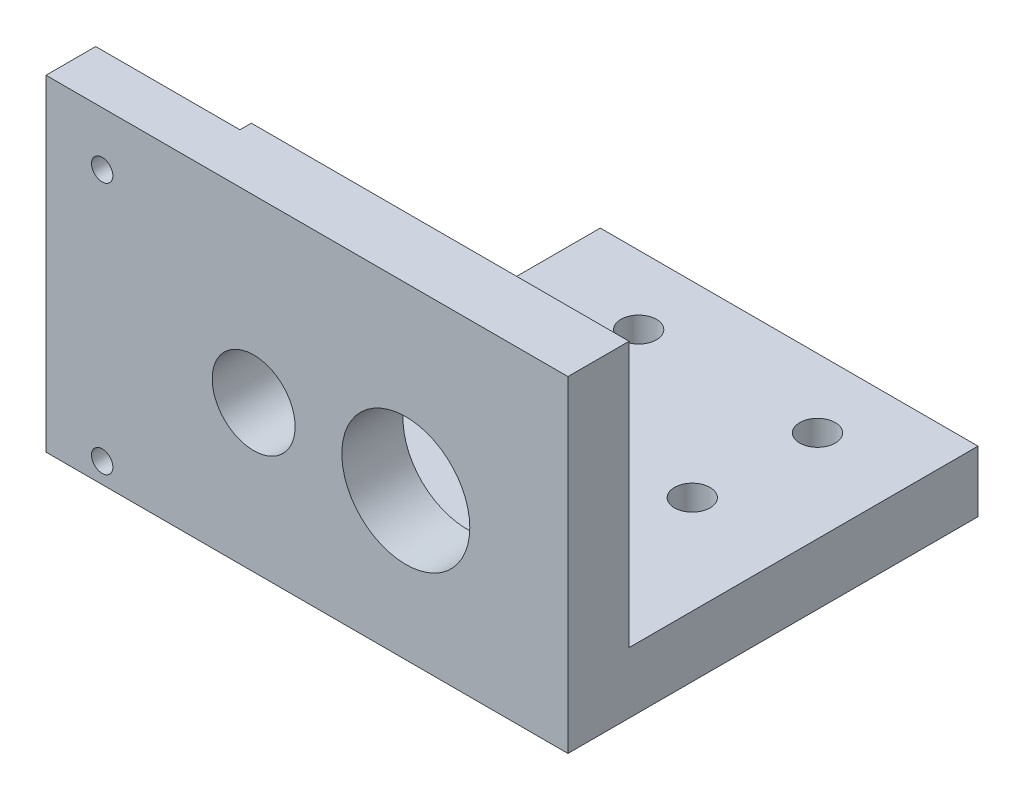
ISO-10303-21;
HEADER;
FILE_DESCRIPTION(('STEP AP214'),'2;1');
FILE_NAME('part.step','',(''),(''),'','','');
FILE_SCHEMA(('AUTOMOTIVE_DESIGN { 1 0 10303 214 1 1 1 1 }'));
ENDSEC;
DATA;
#1=APPLICATION_CONTEXT('core data for automotive mechanical design processes');
#2=APPLICATION_PROTOCOL_DEFINITION('international standard','automotive_design',2000,#1);
#3=PRODUCT_CONTEXT('',#1,'mechanical');
#4=PRODUCT('Part','Part','',(#3));
#5=PRODUCT_RELATED_PRODUCT_CATEGORY('part','',(#4));
#6=PRODUCT_DEFINITION_FORMATION('','',#4);
#7=PRODUCT_DEFINITION_CONTEXT('part definition',#1,'design');
#8=PRODUCT_DEFINITION('design','',#6,#7);
#9=PRODUCT_DEFINITION_SHAPE('','',#8);
#10=(LENGTH_UNIT() NAMED_UNIT(*) SI_UNIT(.MILLI.,.METRE.));
#11=(NAMED_UNIT(*) PLANE_ANGLE_UNIT() SI_UNIT($,.RADIAN.));
#12=(NAMED_UNIT(*) SI_UNIT($,.STERADIAN.) SOLID_ANGLE_UNIT());
#13=UNCERTAINTY_MEASURE_WITH_UNIT(LENGTH_MEASURE(1.E-05),#10,'distance_accuracy_value','');
#14=(GEOMETRIC_REPRESENTATION_CONTEXT(3) GLOBAL_UNCERTAINTY_ASSIGNED_CONTEXT((#13)) GLOBAL_UNIT_ASSIGNED_CONTEXT((#10,
#11,#12)) REPRESENTATION_CONTEXT('',''));
#15=CARTESIAN_POINT('',(0.,0.,0.));
#16=DIRECTION('',(0.,0.,1.));
#17=DIRECTION('',(1.,0.,0.));
#18=AXIS2_PLACEMENT_3D('',#15,#16,#17);
#19=CARTESIAN_POINT('',(-36.7,0.,4.3));
#20=DIRECTION('',(0.,0.,1.));
#21=DIRECTION('',(1.,0.,0.));
#22=AXIS2_PLACEMENT_3D('',#19,#20,#21);
#23=PLANE('',#22);
#24=CARTESIAN_POINT('',(-32.75,-11.2489652654603,4.3));
#25=DIRECTION('',(0.,0.,1.));
#26=DIRECTION('',(1.,0.,0.));
#27=AXIS2_PLACEMENT_3D('',#24,#25,#26);
#28=CIRCLE('',#27,0.749999999999999);
#29=CARTESIAN_POINT('',(-32.,-11.2489652654603,4.3));
#30=VERTEX_POINT('',#29);
#31=EDGE_CURVE('E180',#30,#30,#28,.T.);
#32=ORIENTED_EDGE('',*,*,#31,.F.);
#33=EDGE_LOOP('',(#32));
#34=FACE_BOUND('',#33,.T.);
#35=CARTESIAN_POINT('',(-32.75,-28.9989652654603,4.3));
#36=DIRECTION('',(0.,0.,1.));
#37=DIRECTION('',(1.,0.,0.));
#38=AXIS2_PLACEMENT_3D('',#35,#36,#37);
#39=CIRCLE('',#38,0.749999999999999);
#40=CARTESIAN_POINT('',(-32.,-28.9989652654603,4.3));
#41=VERTEX_POINT('',#40);
#42=EDGE_CURVE('E200',#41,#41,#39,.T.);
#43=ORIENTED_EDGE('',*,*,#42,.F.);
#44=EDGE_LOOP('',(#43));
#45=FACE_BOUND('',#44,.T.);
#46=CARTESIAN_POINT('',(-22.1,-20.1189652654603,4.3));
#47=DIRECTION('',(0.,0.,1.));
#48=DIRECTION('',(1.,0.,0.));
#49=AXIS2_PLACEMENT_3D('',#46,#47,#48);
#50=CIRCLE('',#49,2.915);
#51=CARTESIAN_POINT('',(-19.185,-20.1189652654603,4.3));
#52=VERTEX_POINT('',#51);
#53=EDGE_CURVE('E213',#52,#52,#50,.T.);
#54=ORIENTED_EDGE('',*,*,#53,.F.);
#55=EDGE_LOOP('',(#54));
#56=FACE_BOUND('',#55,.T.);
#57=CARTESIAN_POINT('',(-11.4,-20.1189652654603,4.3));
#58=DIRECTION('',(0.,0.,1.));
#59=DIRECTION('',(1.,0.,0.));
#60=AXIS2_PLACEMENT_3D('',#57,#58,#59);
#61=CIRCLE('',#60,4.5);
#62=CARTESIAN_POINT('',(-6.9,-20.1189652654603,4.3));
#63=VERTEX_POINT('',#62);
#64=EDGE_CURVE('E221',#63,#63,#61,.T.);
#65=ORIENTED_EDGE('',*,*,#64,.F.);
#66=EDGE_LOOP('',(#65));
#67=FACE_BOUND('',#66,.T.);
#68=DIRECTION('',(0.,1.,0.));
#69=VECTOR('',#68,1.);
#70=CARTESIAN_POINT('',(0.,0.,4.3));
#71=LINE('',#70,#69);
#72=CARTESIAN_POINT('',(0.,-7.47548067906314,4.3));
#73=VERTEX_POINT('',#72);
#74=CARTESIAN_POINT('',(0.,-30.4289652654603,4.3));
#75=VERTEX_POINT('',#74);
#76=EDGE_CURVE('E124',#73,#75,#71,.F.);
#77=ORIENTED_EDGE('',*,*,#76,.F.);
#78=DIRECTION('',(1.,0.,0.));
#79=VECTOR('',#78,1.);
#80=CARTESIAN_POINT('',(-36.7,-7.47548067906314,4.3));
#81=LINE('',#80,#79);
#82=CARTESIAN_POINT('',(-36.7,-7.47548067906314,4.3));
#83=VERTEX_POINT('',#82);
#84=EDGE_CURVE('E112',#83,#73,#81,.T.);
#85=ORIENTED_EDGE('',*,*,#84,.F.);
#86=DIRECTION('',(0.,1.,0.));
#87=VECTOR('',#86,1.);
#88=CARTESIAN_POINT('',(-36.7,0.,4.3));
#89=LINE('',#88,#87);
#90=CARTESIAN_POINT('',(-36.7,-30.4289652654603,4.3));
#91=VERTEX_POINT('',#90);
#92=EDGE_CURVE('E122',#83,#91,#89,.F.);
#93=ORIENTED_EDGE('',*,*,#92,.T.);
#94=DIRECTION('',(1.,0.,0.));
#95=VECTOR('',#94,1.);
#96=CARTESIAN_POINT('',(-36.7,-30.4289652654603,4.3));
#97=LINE('',#96,#95);
#98=EDGE_CURVE('E160',#91,#75,#97,.T.);
#99=ORIENTED_EDGE('',*,*,#98,.T.);
#100=EDGE_LOOP('',(#77,#85,#93,#99));
#101=FACE_BOUND('',#100,.T.);
#102=ADVANCED_FACE('F45',(#34,#45,#56,#67,#101),#23,.T.);
#103=CARTESIAN_POINT('',(-36.7,0.,0.));
#104=DIRECTION('',(0.,0.,1.));
#105=DIRECTION('',(1.,0.,0.));
#106=AXIS2_PLACEMENT_3D('',#103,#104,#105);
#107=PLANE('',#106);
#108=CARTESIAN_POINT('',(-11.4,-20.1189652654603,0.));
#109=DIRECTION('',(0.,0.,1.));
#110=DIRECTION('',(1.,0.,0.));
#111=AXIS2_PLACEMENT_3D('',#108,#109,#110);
#112=CIRCLE('',#111,4.5);
#113=CARTESIAN_POINT('',(-6.9,-20.1189652654603,0.));
#114=VERTEX_POINT('',#113);
#115=EDGE_CURVE('E217',#114,#114,#112,.T.);
#116=ORIENTED_EDGE('',*,*,#115,.T.);
#117=EDGE_LOOP('',(#116));
#118=FACE_BOUND('',#117,.T.);
#119=CARTESIAN_POINT('',(-22.1,-20.1189652654603,0.));
#120=DIRECTION('',(0.,0.,1.));
#121=DIRECTION('',(1.,0.,0.));
#122=AXIS2_PLACEMENT_3D('',#119,#120,#121);
#123=CIRCLE('',#122,2.915);
#124=CARTESIAN_POINT('',(-19.185,-20.1189652654603,0.));
#125=VERTEX_POINT('',#124);
#126=EDGE_CURVE('E184',#125,#125,#123,.T.);
#127=ORIENTED_EDGE('',*,*,#126,.T.);
#128=EDGE_LOOP('',(#127));
#129=FACE_BOUND('',#128,.T.);
#130=DIRECTION('',(1.,0.,0.));
#131=VECTOR('',#130,1.);
#132=CARTESIAN_POINT('',(-36.7,-7.47548067906314,0.));
#133=LINE('',#132,#131);
#134=CARTESIAN_POINT('',(-26.56,-7.47548067906314,0.));
#135=VERTEX_POINT('',#134);
#136=CARTESIAN_POINT('',(0.,-7.47548067906314,0.));
#137=VERTEX_POINT('',#136);
#138=EDGE_CURVE('E126',#135,#137,#133,.T.);
#139=ORIENTED_EDGE('',*,*,#138,.T.);
#140=DIRECTION('',(0.,-1.,0.));
#141=VECTOR('',#140,1.);
#142=CARTESIAN_POINT('',(0.,0.,0.));
#143=LINE('',#142,#141);
#144=CARTESIAN_POINT('',(0.,-26.1289652654603,0.));
#145=VERTEX_POINT('',#144);
#146=EDGE_CURVE('E155',#137,#145,#143,.T.);
#147=ORIENTED_EDGE('',*,*,#146,.T.);
#148=DIRECTION('',(1.,0.,0.));
#149=VECTOR('',#148,1.);
#150=CARTESIAN_POINT('',(-36.7,-26.1289652654603,0.));
#151=LINE('',#150,#149);
#152=CARTESIAN_POINT('',(-26.56,-26.1289652654603,0.));
#153=VERTEX_POINT('',#152);
#154=EDGE_CURVE('E164',#153,#145,#151,.T.);
#155=ORIENTED_EDGE('',*,*,#154,.F.);
#156=DIRECTION('',(0.,1.,0.));
#157=VECTOR('',#156,1.);
#158=CARTESIAN_POINT('',(-26.56,0.,0.));
#159=LINE('',#158,#157);
#160=EDGE_CURVE('E147',#153,#135,#159,.T.);
#161=ORIENTED_EDGE('',*,*,#160,.T.);
#162=EDGE_LOOP('',(#139,#147,#155,#161));
#163=FACE_BOUND('',#162,.T.);
#164=ADVANCED_FACE('F246',(#118,#129,#163),#107,.F.);
#165=CARTESIAN_POINT('',(-36.7,0.,0.));
#166=DIRECTION('',(-1.,0.,0.));
#167=DIRECTION('',(0.,0.,1.));
#168=AXIS2_PLACEMENT_3D('',#165,#166,#167);
#169=PLANE('',#168);
#170=ORIENTED_EDGE('',*,*,#92,.F.);
#171=DIRECTION('',(0.,0.,-1.));
#172=VECTOR('',#171,1.);
#173=CARTESIAN_POINT('',(-36.7,-7.47548067906314,4.3));
#174=LINE('',#173,#172);
#175=CARTESIAN_POINT('',(-36.7,-7.47548067906314,0.804485264048083));
#176=VERTEX_POINT('',#175);
#177=EDGE_CURVE('E109',#83,#176,#174,.T.);
#178=ORIENTED_EDGE('',*,*,#177,.T.);
#179=DIRECTION('',(0.,1.,0.));
#180=VECTOR('',#179,1.);
#181=CARTESIAN_POINT('',(-36.7,0.,0.804485264048083));
#182=LINE('',#181,#180);
#183=CARTESIAN_POINT('',(-36.7,-30.4289652654603,0.804485264048083));
#184=VERTEX_POINT('',#183);
#185=EDGE_CURVE('E163',#184,#176,#182,.T.);
#186=ORIENTED_EDGE('',*,*,#185,.F.);
#187=DIRECTION('',(0.,0.,-1.));
#188=VECTOR('',#187,1.);
#189=CARTESIAN_POINT('',(-36.7,-30.4289652654603,0.));
#190=LINE('',#189,#188);
#191=EDGE_CURVE('E131',#91,#184,#190,.T.);
#192=ORIENTED_EDGE('',*,*,#191,.F.);
#193=EDGE_LOOP('',(#170,#178,#186,#192));
#194=FACE_BOUND('',#193,.T.);
#195=ADVANCED_FACE('F129',(#194),#169,.T.);
#196=CARTESIAN_POINT('',(0.,0.,0.));
#197=DIRECTION('',(-1.,0.,0.));
#198=DIRECTION('',(0.,0.,1.));
#199=AXIS2_PLACEMENT_3D('',#196,#197,#198);
#200=PLANE('',#199);
#201=DIRECTION('',(0.,0.,-1.));
#202=VECTOR('',#201,1.);
#203=CARTESIAN_POINT('',(0.,-7.47548067906314,4.3));
#204=LINE('',#203,#202);
#205=EDGE_CURVE('E117',#73,#137,#204,.T.);
#206=ORIENTED_EDGE('',*,*,#205,.F.);
#207=ORIENTED_EDGE('',*,*,#76,.T.);
#208=DIRECTION('',(0.,0.,-1.));
#209=VECTOR('',#208,1.);
#210=CARTESIAN_POINT('',(0.,-30.4289652654603,0.));
#211=LINE('',#210,#209);
#212=CARTESIAN_POINT('',(0.,-30.4289652654603,-24.5342396858782));
#213=VERTEX_POINT('',#212);
#214=EDGE_CURVE('E142',#75,#213,#211,.T.);
#215=ORIENTED_EDGE('',*,*,#214,.T.);
#216=DIRECTION('',(0.,-1.,0.));
#217=VECTOR('',#216,1.);
#218=CARTESIAN_POINT('',(0.,-26.1289652654603,-24.5342396858782));
#219=LINE('',#218,#217);
#220=CARTESIAN_POINT('',(0.,-26.1289652654603,-24.5342396858782));
#221=VERTEX_POINT('',#220);
#222=EDGE_CURVE('E146',#221,#213,#219,.T.);
#223=ORIENTED_EDGE('',*,*,#222,.F.);
#224=DIRECTION('',(0.,0.,-1.));
#225=VECTOR('',#224,1.);
#226=CARTESIAN_POINT('',(0.,-26.1289652654603,0.));
#227=LINE('',#226,#225);
#228=EDGE_CURVE('E151',#145,#221,#227,.T.);
#229=ORIENTED_EDGE('',*,*,#228,.F.);
#230=ORIENTED_EDGE('',*,*,#146,.F.);
#231=EDGE_LOOP('',(#206,#207,#215,#223,#229,#230));
#232=FACE_BOUND('',#231,.T.);
#233=ADVANCED_FACE('F262',(#232),#200,.F.);
#234=CARTESIAN_POINT('',(-26.56,-30.4289652654603,0.804485264048083));
#235=DIRECTION('',(1.,0.,0.));
#236=DIRECTION('',(0.,0.,-1.));
#237=AXIS2_PLACEMENT_3D('',#234,#235,#236);
#238=PLANE('',#237);
#239=DIRECTION('',(0.,0.,1.));
#240=VECTOR('',#239,1.);
#241=CARTESIAN_POINT('',(-26.56,-7.47548067906314,0.804485264048083));
#242=LINE('',#241,#240);
#243=CARTESIAN_POINT('',(-26.56,-7.47548067906315,0.804485264048083));
#244=VERTEX_POINT('',#243);
#245=EDGE_CURVE('E60',#135,#244,#242,.T.);
#246=ORIENTED_EDGE('',*,*,#245,.F.);
#247=ORIENTED_EDGE('',*,*,#160,.F.);
#248=DIRECTION('',(0.,0.,1.));
#249=VECTOR('',#248,1.);
#250=CARTESIAN_POINT('',(-26.56,-26.1289652654603,0.));
#251=LINE('',#250,#249);
#252=CARTESIAN_POINT('',(-26.56,-26.1289652654603,-24.5342396858782));
#253=VERTEX_POINT('',#252);
#254=EDGE_CURVE('E238',#253,#153,#251,.T.);
#255=ORIENTED_EDGE('',*,*,#254,.F.);
#256=DIRECTION('',(0.,1.,0.));
#257=VECTOR('',#256,1.);
#258=CARTESIAN_POINT('',(-26.56,-26.1289652654603,-24.5342396858782));
#259=LINE('',#258,#257);
#260=CARTESIAN_POINT('',(-26.56,-30.4289652654603,-24.5342396858782));
#261=VERTEX_POINT('',#260);
#262=EDGE_CURVE('E54',#261,#253,#259,.T.);
#263=ORIENTED_EDGE('',*,*,#262,.F.);
#264=DIRECTION('',(0.,0.,-1.));
#265=VECTOR('',#264,1.);
#266=CARTESIAN_POINT('',(-26.56,-30.4289652654603,0.804485264048083));
#267=LINE('',#266,#265);
#268=CARTESIAN_POINT('',(-26.56,-30.4289652654603,0.804485264048083));
#269=VERTEX_POINT('',#268);
#270=EDGE_CURVE('E225',#269,#261,#267,.T.);
#271=ORIENTED_EDGE('',*,*,#270,.F.);
#272=DIRECTION('',(0.,1.,0.));
#273=VECTOR('',#272,1.);
#274=CARTESIAN_POINT('',(-26.56,-30.4289652654603,0.804485264048083));
#275=LINE('',#274,#273);
#276=EDGE_CURVE('E234',#269,#244,#275,.T.);
#277=ORIENTED_EDGE('',*,*,#276,.T.);
#278=EDGE_LOOP('',(#246,#247,#255,#263,#271,#277));
#279=FACE_BOUND('',#278,.T.);
#280=ADVANCED_FACE('F249',(#279),#238,.F.);
#281=CARTESIAN_POINT('',(-47.6934680126959,-30.4289652654603,0.804485264048083));
#282=DIRECTION('',(0.,0.,1.));
#283=DIRECTION('',(1.,0.,0.));
#284=AXIS2_PLACEMENT_3D('',#281,#282,#283);
#285=PLANE('',#284);
#286=CARTESIAN_POINT('',(-32.75,-28.9989652654603,0.804485264048083));
#287=DIRECTION('',(0.,0.,1.));
#288=DIRECTION('',(1.,0.,0.));
#289=AXIS2_PLACEMENT_3D('',#286,#287,#288);
#290=CIRCLE('',#289,0.749999999999999);
#291=CARTESIAN_POINT('',(-32.,-28.9989652654603,0.804485264048083));
#292=VERTEX_POINT('',#291);
#293=EDGE_CURVE('E175',#292,#292,#290,.F.);
#294=ORIENTED_EDGE('',*,*,#293,.F.);
#295=EDGE_LOOP('',(#294));
#296=FACE_BOUND('',#295,.T.);
#297=CARTESIAN_POINT('',(-32.75,-11.2489652654603,0.804485264048083));
#298=DIRECTION('',(0.,0.,1.));
#299=DIRECTION('',(1.,0.,0.));
#300=AXIS2_PLACEMENT_3D('',#297,#298,#299);
#301=CIRCLE('',#300,0.749999999999999);
#302=CARTESIAN_POINT('',(-32.,-11.2489652654603,0.804485264048083));
#303=VERTEX_POINT('',#302);
#304=EDGE_CURVE('E179',#303,#303,#301,.F.);
#305=ORIENTED_EDGE('',*,*,#304,.F.);
#306=EDGE_LOOP('',(#305));
#307=FACE_BOUND('',#306,.T.);
#308=DIRECTION('',(-1.,0.,0.));
#309=VECTOR('',#308,1.);
#310=CARTESIAN_POINT('',(-47.6934680126959,-7.47548067906314,0.804485264048083));
#311=LINE('',#310,#309);
#312=EDGE_CURVE('E11',#244,#176,#311,.T.);
#313=ORIENTED_EDGE('',*,*,#312,.F.);
#314=ORIENTED_EDGE('',*,*,#276,.F.);
#315=DIRECTION('',(1.,0.,0.));
#316=VECTOR('',#315,1.);
#317=CARTESIAN_POINT('',(-47.6934680126959,-30.4289652654603,0.804485264048083));
#318=LINE('',#317,#316);
#319=EDGE_CURVE('E68',#184,#269,#318,.T.);
#320=ORIENTED_EDGE('',*,*,#319,.F.);
#321=ORIENTED_EDGE('',*,*,#185,.T.);
#322=EDGE_LOOP('',(#313,#314,#320,#321));
#323=FACE_BOUND('',#322,.T.);
#324=ADVANCED_FACE('F300',(#296,#307,#323),#285,.F.);
#325=CARTESIAN_POINT('',(-36.7,-30.4289652654603,0.));
#326=DIRECTION('',(0.,-1.,0.));
#327=DIRECTION('',(0.,0.,-1.));
#328=AXIS2_PLACEMENT_3D('',#325,#326,#327);
#329=PLANE('',#328);
#330=CARTESIAN_POINT('',(-19.0272678250487,-30.4289652654603,-19.7018874905712));
#331=DIRECTION('',(0.,1.,0.));
#332=DIRECTION('',(0.,0.,1.));
#333=AXIS2_PLACEMENT_3D('',#330,#331,#332);
#334=CIRCLE('',#333,1.25);
#335=CARTESIAN_POINT('',(-19.0272678250487,-30.4289652654603,-18.4518874905712));
#336=VERTEX_POINT('',#335);
#337=EDGE_CURVE('E274',#336,#336,#334,.T.);
#338=ORIENTED_EDGE('',*,*,#337,.T.);
#339=EDGE_LOOP('',(#338));
#340=FACE_BOUND('',#339,.T.);
#341=CARTESIAN_POINT('',(-6.90722825195067,-30.4289652654603,-11.3503035009761));
#342=DIRECTION('',(0.,1.,0.));
#343=DIRECTION('',(0.,0.,1.));
#344=AXIS2_PLACEMENT_3D('',#341,#342,#343);
#345=CIRCLE('',#344,1.25);
#346=CARTESIAN_POINT('',(-6.90722825195067,-30.4289652654603,-10.1003035009761));
#347=VERTEX_POINT('',#346);
#348=EDGE_CURVE('E273',#347,#347,#345,.T.);
#349=ORIENTED_EDGE('',*,*,#348,.T.);
#350=EDGE_LOOP('',(#349));
#351=FACE_BOUND('',#350,.T.);
#352=CARTESIAN_POINT('',(-6.45179676042584,-30.4289652654603,-19.7018874905712));
#353=DIRECTION('',(0.,1.,0.));
#354=DIRECTION('',(0.,0.,1.));
#355=AXIS2_PLACEMENT_3D('',#352,#353,#354);
#356=CIRCLE('',#355,1.25);
#357=CARTESIAN_POINT('',(-6.45179676042584,-30.4289652654603,-18.4518874905712));
#358=VERTEX_POINT('',#357);
#359=EDGE_CURVE('E269',#358,#358,#356,.T.);
#360=ORIENTED_EDGE('',*,*,#359,.T.);
#361=EDGE_LOOP('',(#360));
#362=FACE_BOUND('',#361,.T.);
#363=CARTESIAN_POINT('',(-19.0272678250487,-30.4289652654603,-11.3503035009761));
#364=DIRECTION('',(0.,1.,0.));
#365=DIRECTION('',(0.,0.,1.));
#366=AXIS2_PLACEMENT_3D('',#363,#364,#365);
#367=CIRCLE('',#366,1.25);
#368=CARTESIAN_POINT('',(-19.0272678250487,-30.4289652654603,-10.1003035009761));
#369=VERTEX_POINT('',#368);
#370=EDGE_CURVE('E190',#369,#369,#367,.T.);
#371=ORIENTED_EDGE('',*,*,#370,.T.);
#372=EDGE_LOOP('',(#371));
#373=FACE_BOUND('',#372,.T.);
#374=ORIENTED_EDGE('',*,*,#270,.T.);
#375=DIRECTION('',(1.,0.,0.));
#376=VECTOR('',#375,1.);
#377=CARTESIAN_POINT('',(-36.7,-30.4289652654603,-24.5342396858782));
#378=LINE('',#377,#376);
#379=EDGE_CURVE('E133',#261,#213,#378,.T.);
#380=ORIENTED_EDGE('',*,*,#379,.T.);
#381=ORIENTED_EDGE('',*,*,#214,.F.);
#382=ORIENTED_EDGE('',*,*,#98,.F.);
#383=ORIENTED_EDGE('',*,*,#191,.T.);
#384=ORIENTED_EDGE('',*,*,#319,.T.);
#385=EDGE_LOOP('',(#374,#380,#381,#382,#383,#384));
#386=FACE_BOUND('',#385,.T.);
#387=ADVANCED_FACE('F47',(#340,#351,#362,#373,#386),#329,.T.);
#388=CARTESIAN_POINT('',(-36.7,-26.1289652654603,0.));
#389=DIRECTION('',(0.,-1.,0.));
#390=DIRECTION('',(0.,0.,-1.));
#391=AXIS2_PLACEMENT_3D('',#388,#389,#390);
#392=PLANE('',#391);
#393=CARTESIAN_POINT('',(-19.0272678250487,-26.1289652654603,-19.7018874905712));
#394=DIRECTION('',(0.,-1.,0.));
#395=DIRECTION('',(0.,0.,-1.));
#396=AXIS2_PLACEMENT_3D('',#393,#394,#395);
#397=CIRCLE('',#396,1.25);
#398=CARTESIAN_POINT('',(-19.0272678250487,-26.1289652654603,-18.4518874905712));
#399=VERTEX_POINT('',#398);
#400=EDGE_CURVE('E197',#399,#399,#397,.T.);
#401=ORIENTED_EDGE('',*,*,#400,.T.);
#402=EDGE_LOOP('',(#401));
#403=FACE_BOUND('',#402,.T.);
#404=CARTESIAN_POINT('',(-6.90722825195067,-26.1289652654603,-11.3503035009761));
#405=DIRECTION('',(0.,-1.,0.));
#406=DIRECTION('',(0.,0.,-1.));
#407=AXIS2_PLACEMENT_3D('',#404,#405,#406);
#408=CIRCLE('',#407,1.25);
#409=CARTESIAN_POINT('',(-6.90722825195067,-26.1289652654603,-10.1003035009761));
#410=VERTEX_POINT('',#409);
#411=EDGE_CURVE('E194',#410,#410,#408,.T.);
#412=ORIENTED_EDGE('',*,*,#411,.T.);
#413=EDGE_LOOP('',(#412));
#414=FACE_BOUND('',#413,.T.);
#415=CARTESIAN_POINT('',(-6.45179676042584,-26.1289652654603,-19.7018874905712));
#416=DIRECTION('',(0.,-1.,0.));
#417=DIRECTION('',(0.,0.,-1.));
#418=AXIS2_PLACEMENT_3D('',#415,#416,#417);
#419=CIRCLE('',#418,1.25);
#420=CARTESIAN_POINT('',(-6.45179676042584,-26.1289652654603,-18.4518874905712));
#421=VERTEX_POINT('',#420);
#422=EDGE_CURVE('E189',#421,#421,#419,.T.);
#423=ORIENTED_EDGE('',*,*,#422,.T.);
#424=EDGE_LOOP('',(#423));
#425=FACE_BOUND('',#424,.T.);
#426=CARTESIAN_POINT('',(-19.0272678250487,-26.1289652654603,-11.3503035009761));
#427=DIRECTION('',(0.,-1.,0.));
#428=DIRECTION('',(0.,0.,-1.));
#429=AXIS2_PLACEMENT_3D('',#426,#427,#428);
#430=CIRCLE('',#429,1.25);
#431=CARTESIAN_POINT('',(-19.0272678250487,-26.1289652654603,-10.1003035009761));
#432=VERTEX_POINT('',#431);
#433=EDGE_CURVE('E185',#432,#432,#430,.T.);
#434=ORIENTED_EDGE('',*,*,#433,.T.);
#435=EDGE_LOOP('',(#434));
#436=FACE_BOUND('',#435,.T.);
#437=DIRECTION('',(1.,0.,0.));
#438=VECTOR('',#437,1.);
#439=CARTESIAN_POINT('',(-36.7,-26.1289652654603,-24.5342396858782));
#440=LINE('',#439,#438);
#441=EDGE_CURVE('E137',#253,#221,#440,.T.);
#442=ORIENTED_EDGE('',*,*,#441,.F.);
#443=ORIENTED_EDGE('',*,*,#254,.T.);
#444=ORIENTED_EDGE('',*,*,#154,.T.);
#445=ORIENTED_EDGE('',*,*,#228,.T.);
#446=EDGE_LOOP('',(#442,#443,#444,#445));
#447=FACE_BOUND('',#446,.T.);
#448=ADVANCED_FACE('F252',(#403,#414,#425,#436,#447),#392,.F.);
#449=CARTESIAN_POINT('',(-36.7,-26.1289652654603,-24.5342396858782));
#450=DIRECTION('',(0.,0.,1.));
#451=DIRECTION('',(1.,0.,0.));
#452=AXIS2_PLACEMENT_3D('',#449,#450,#451);
#453=PLANE('',#452);
#454=ORIENTED_EDGE('',*,*,#379,.F.);
#455=ORIENTED_EDGE('',*,*,#262,.T.);
#456=ORIENTED_EDGE('',*,*,#441,.T.);
#457=ORIENTED_EDGE('',*,*,#222,.T.);
#458=EDGE_LOOP('',(#454,#455,#456,#457));
#459=FACE_BOUND('',#458,.T.);
#460=ADVANCED_FACE('F257',(#459),#453,.F.);
#461=CARTESIAN_POINT('',(-11.4,-20.1189652654603,4.3));
#462=DIRECTION('',(0.,0.,-1.));
#463=DIRECTION('',(-1.,0.,0.));
#464=AXIS2_PLACEMENT_3D('',#461,#462,#463);
#465=CYLINDRICAL_SURFACE('',#464,4.5);
#466=ORIENTED_EDGE('',*,*,#64,.T.);
#467=EDGE_LOOP('',(#466));
#468=FACE_BOUND('',#467,.T.);
#469=ORIENTED_EDGE('',*,*,#115,.F.);
#470=EDGE_LOOP('',(#469));
#471=FACE_BOUND('',#470,.T.);
#472=ADVANCED_FACE('F299',(#468,#471),#465,.F.);
#473=CARTESIAN_POINT('',(-22.1,-20.1189652654603,4.3));
#474=DIRECTION('',(0.,0.,-1.));
#475=DIRECTION('',(-1.,0.,0.));
#476=AXIS2_PLACEMENT_3D('',#473,#474,#475);
#477=CYLINDRICAL_SURFACE('',#476,2.915);
#478=ORIENTED_EDGE('',*,*,#53,.T.);
#479=EDGE_LOOP('',(#478));
#480=FACE_BOUND('',#479,.T.);
#481=ORIENTED_EDGE('',*,*,#126,.F.);
#482=EDGE_LOOP('',(#481));
#483=FACE_BOUND('',#482,.T.);
#484=ADVANCED_FACE('F326',(#480,#483),#477,.F.);
#485=CARTESIAN_POINT('',(-32.75,-28.9989652654603,4.3));
#486=DIRECTION('',(0.,0.,-1.));
#487=DIRECTION('',(-1.,0.,0.));
#488=AXIS2_PLACEMENT_3D('',#485,#486,#487);
#489=CYLINDRICAL_SURFACE('',#488,0.749999999999999);
#490=ORIENTED_EDGE('',*,*,#42,.T.);
#491=EDGE_LOOP('',(#490));
#492=FACE_BOUND('',#491,.T.);
#493=ORIENTED_EDGE('',*,*,#293,.T.);
#494=EDGE_LOOP('',(#493));
#495=FACE_BOUND('',#494,.T.);
#496=ADVANCED_FACE('F330',(#492,#495),#489,.F.);
#497=CARTESIAN_POINT('',(-32.75,-11.2489652654603,4.3));
#498=DIRECTION('',(0.,0.,-1.));
#499=DIRECTION('',(-1.,0.,0.));
#500=AXIS2_PLACEMENT_3D('',#497,#498,#499);
#501=CYLINDRICAL_SURFACE('',#500,0.749999999999999);
#502=ORIENTED_EDGE('',*,*,#31,.T.);
#503=EDGE_LOOP('',(#502));
#504=FACE_BOUND('',#503,.T.);
#505=ORIENTED_EDGE('',*,*,#304,.T.);
#506=EDGE_LOOP('',(#505));
#507=FACE_BOUND('',#506,.T.);
#508=ADVANCED_FACE('F289',(#504,#507),#501,.F.);
#509=CARTESIAN_POINT('',(-19.0272678250487,-30.4289652654603,-11.3503035009761));
#510=DIRECTION('',(0.,1.,0.));
#511=DIRECTION('',(0.,0.,1.));
#512=AXIS2_PLACEMENT_3D('',#509,#510,#511);
#513=CYLINDRICAL_SURFACE('',#512,1.25);
#514=CARTESIAN_POINT('',(-19.0272678250487,-30.4289652654603,-10.1003035009761));
#515=CARTESIAN_POINT('',(-19.0272678250487,-30.3841735987936,-10.1003035009761));
#516=CARTESIAN_POINT('',(-19.0272678250487,-30.3393819321269,-10.1003035009761));
#517=CARTESIAN_POINT('',(-19.0272678250487,-30.2497985987936,-10.1003035009761));
#518=CARTESIAN_POINT('',(-19.0272678250487,-30.2050069321269,-10.1003035009761));
#519=CARTESIAN_POINT('',(-19.0272678250487,-30.1154235987936,-10.1003035009761));
#520=CARTESIAN_POINT('',(-19.0272678250487,-30.0706319321269,-10.1003035009761));
#521=CARTESIAN_POINT('',(-19.0272678250487,-29.9810485987936,-10.1003035009761));
#522=CARTESIAN_POINT('',(-19.0272678250487,-29.9362569321269,-10.1003035009761));
#523=CARTESIAN_POINT('',(-19.0272678250487,-29.8466735987936,-10.1003035009761));
#524=CARTESIAN_POINT('',(-19.0272678250487,-29.8018819321269,-10.1003035009761));
#525=CARTESIAN_POINT('',(-19.0272678250487,-29.7122985987936,-10.1003035009761));
#526=CARTESIAN_POINT('',(-19.0272678250487,-29.6675069321269,-10.1003035009761));
#527=CARTESIAN_POINT('',(-19.0272678250487,-29.5779235987936,-10.1003035009761));
#528=CARTESIAN_POINT('',(-19.0272678250487,-29.5331319321269,-10.1003035009761));
#529=CARTESIAN_POINT('',(-19.0272678250487,-29.4435485987936,-10.1003035009761));
#530=CARTESIAN_POINT('',(-19.0272678250487,-29.3987569321269,-10.1003035009761));
#531=CARTESIAN_POINT('',(-19.0272678250487,-29.3091735987936,-10.1003035009761));
#532=CARTESIAN_POINT('',(-19.0272678250487,-29.2643819321269,-10.1003035009761));
#533=CARTESIAN_POINT('',(-19.0272678250487,-29.1747985987936,-10.1003035009761));
#534=CARTESIAN_POINT('',(-19.0272678250487,-29.1300069321269,-10.1003035009761));
#535=CARTESIAN_POINT('',(-19.0272678250487,-29.0404235987936,-10.1003035009761));
#536=CARTESIAN_POINT('',(-19.0272678250487,-28.9956319321269,-10.1003035009761));
#537=CARTESIAN_POINT('',(-19.0272678250487,-28.9060485987936,-10.1003035009761));
#538=CARTESIAN_POINT('',(-19.0272678250487,-28.8612569321269,-10.1003035009761));
#539=CARTESIAN_POINT('',(-19.0272678250487,-28.7716735987936,-10.1003035009761));
#540=CARTESIAN_POINT('',(-19.0272678250487,-28.7268819321269,-10.1003035009761));
#541=CARTESIAN_POINT('',(-19.0272678250487,-28.6372985987936,-10.1003035009761));
#542=CARTESIAN_POINT('',(-19.0272678250487,-28.5925069321269,-10.1003035009761));
#543=CARTESIAN_POINT('',(-19.0272678250487,-28.5029235987936,-10.1003035009761));
#544=CARTESIAN_POINT('',(-19.0272678250487,-28.4581319321269,-10.1003035009761));
#545=CARTESIAN_POINT('',(-19.0272678250487,-28.3685485987936,-10.1003035009761));
#546=CARTESIAN_POINT('',(-19.0272678250487,-28.3237569321269,-10.1003035009761));
#547=CARTESIAN_POINT('',(-19.0272678250487,-28.2341735987936,-10.1003035009761));
#548=CARTESIAN_POINT('',(-19.0272678250487,-28.1893819321269,-10.1003035009761));
#549=CARTESIAN_POINT('',(-19.0272678250487,-28.0997985987936,-10.1003035009761));
#550=CARTESIAN_POINT('',(-19.0272678250487,-28.0550069321269,-10.1003035009761));
#551=CARTESIAN_POINT('',(-19.0272678250487,-27.9654235987936,-10.1003035009761));
#552=CARTESIAN_POINT('',(-19.0272678250487,-27.9206319321269,-10.1003035009761));
#553=CARTESIAN_POINT('',(-19.0272678250487,-27.8310485987936,-10.1003035009761));
#554=CARTESIAN_POINT('',(-19.0272678250487,-27.7862569321269,-10.1003035009761));
#555=CARTESIAN_POINT('',(-19.0272678250487,-27.6966735987936,-10.1003035009761));
#556=CARTESIAN_POINT('',(-19.0272678250487,-27.6518819321269,-10.1003035009761));
#557=CARTESIAN_POINT('',(-19.0272678250487,-27.5622985987936,-10.1003035009761));
#558=CARTESIAN_POINT('',(-19.0272678250487,-27.5175069321269,-10.1003035009761));
#559=CARTESIAN_POINT('',(-19.0272678250487,-27.4279235987936,-10.1003035009761));
#560=CARTESIAN_POINT('',(-19.0272678250487,-27.3831319321269,-10.1003035009761));
#561=CARTESIAN_POINT('',(-19.0272678250487,-27.2935485987936,-10.1003035009761));
#562=CARTESIAN_POINT('',(-19.0272678250487,-27.2487569321269,-10.1003035009761));
#563=CARTESIAN_POINT('',(-19.0272678250487,-27.1591735987936,-10.1003035009761));
#564=CARTESIAN_POINT('',(-19.0272678250487,-27.1143819321269,-10.1003035009761));
#565=CARTESIAN_POINT('',(-19.0272678250487,-27.0247985987936,-10.1003035009761));
#566=CARTESIAN_POINT('',(-19.0272678250487,-26.9800069321269,-10.1003035009761));
#567=CARTESIAN_POINT('',(-19.0272678250487,-26.8904235987936,-10.1003035009761));
#568=CARTESIAN_POINT('',(-19.0272678250487,-26.8456319321269,-10.1003035009761));
#569=CARTESIAN_POINT('',(-19.0272678250487,-26.7560485987936,-10.1003035009761));
#570=CARTESIAN_POINT('',(-19.0272678250487,-26.7112569321269,-10.1003035009761));
#571=CARTESIAN_POINT('',(-19.0272678250487,-26.6216735987936,-10.1003035009761));
#572=CARTESIAN_POINT('',(-19.0272678250487,-26.5768819321269,-10.1003035009761));
#573=CARTESIAN_POINT('',(-19.0272678250487,-26.4872985987936,-10.1003035009761));
#574=CARTESIAN_POINT('',(-19.0272678250487,-26.4425069321269,-10.1003035009761));
#575=CARTESIAN_POINT('',(-19.0272678250487,-26.3529235987936,-10.1003035009761));
#576=CARTESIAN_POINT('',(-19.0272678250487,-26.3081319321269,-10.1003035009761));
#577=CARTESIAN_POINT('',(-19.0272678250487,-26.2185485987936,-10.1003035009761));
#578=CARTESIAN_POINT('',(-19.0272678250487,-26.1737569321269,-10.1003035009761));
#579=CARTESIAN_POINT('',(-19.0272678250487,-26.1289652654603,-10.1003035009761));
#580=B_SPLINE_CURVE_WITH_KNOTS('',3,(#514,#515,#516,#517,#518,#519,#520,#521,#522,#523,#524,
#525,#526,#527,#528,#529,#530,#531,#532,#533,#534,#535,#536,#537,#538,#539,#540,#541,#542,#543,
#544,#545,#546,#547,#548,#549,#550,#551,#552,#553,#554,#555,#556,#557,#558,#559,#560,#561,#562,
#563,#564,#565,#566,#567,#568,#569,#570,#571,#572,#573,#574,#575,#576,#577,#578,#579),
.UNSPECIFIED.,.F.,.F.,(4,2,2,2,2,2,2,2,2,2,2,2,2,2,2,2,2,2,2,2,2,2,2,2,2,2,2,2,2,2,2,2,4),(0.,
0.134374999999999,0.268749999999998,0.403124999999997,0.5375,0.671874999999999,
0.806249999999998,0.940625,1.075,1.209375,1.34375,1.478125,1.6125,1.746875,1.88125,2.015625,
2.15,2.284375,2.41875,2.553125,2.6875,2.821875,2.95625,3.090625,3.225,3.359375,3.49375,3.628125,
3.7625,3.896875,4.03125,4.165625,4.3),.UNSPECIFIED.);
#581=EDGE_CURVE('BSEAM285',#369,#432,#580,.T.);
#582=ORIENTED_EDGE('',*,*,#370,.F.);
#583=ORIENTED_EDGE('',*,*,#433,.F.);
#584=ORIENTED_EDGE('',*,*,#581,.T.);
#585=ORIENTED_EDGE('',*,*,#581,.F.);
#586=EDGE_LOOP('',(#582,#584,#583,#585));
#587=FACE_BOUND('',#586,.T.);
#588=ADVANCED_FACE('F285',(#587),#513,.F.);
#589=CARTESIAN_POINT('',(-6.45179676042584,-30.4289652654603,-19.7018874905712));
#590=DIRECTION('',(0.,1.,0.));
#591=DIRECTION('',(0.,0.,1.));
#592=AXIS2_PLACEMENT_3D('',#589,#590,#591);
#593=CYLINDRICAL_SURFACE('',#592,1.25);
#594=CARTESIAN_POINT('',(-6.45179676042584,-30.4289652654603,-18.4518874905712));
#595=CARTESIAN_POINT('',(-6.45179676042584,-30.3841735987936,-18.4518874905712));
#596=CARTESIAN_POINT('',(-6.45179676042584,-30.3393819321269,-18.4518874905712));
#597=CARTESIAN_POINT('',(-6.45179676042584,-30.2497985987936,-18.4518874905712));
#598=CARTESIAN_POINT('',(-6.45179676042584,-30.2050069321269,-18.4518874905712));
#599=CARTESIAN_POINT('',(-6.45179676042584,-30.1154235987936,-18.4518874905712));
#600=CARTESIAN_POINT('',(-6.45179676042584,-30.0706319321269,-18.4518874905712));
#601=CARTESIAN_POINT('',(-6.45179676042584,-29.9810485987936,-18.4518874905712));
#602=CARTESIAN_POINT('',(-6.45179676042584,-29.9362569321269,-18.4518874905712));
#603=CARTESIAN_POINT('',(-6.45179676042584,-29.8466735987936,-18.4518874905712));
#604=CARTESIAN_POINT('',(-6.45179676042584,-29.8018819321269,-18.4518874905712));
#605=CARTESIAN_POINT('',(-6.45179676042584,-29.7122985987936,-18.4518874905712));
#606=CARTESIAN_POINT('',(-6.45179676042584,-29.6675069321269,-18.4518874905712));
#607=CARTESIAN_POINT('',(-6.45179676042584,-29.5779235987936,-18.4518874905712));
#608=CARTESIAN_POINT('',(-6.45179676042584,-29.5331319321269,-18.4518874905712));
#609=CARTESIAN_POINT('',(-6.45179676042584,-29.4435485987936,-18.4518874905712));
#610=CARTESIAN_POINT('',(-6.45179676042584,-29.3987569321269,-18.4518874905712));
#611=CARTESIAN_POINT('',(-6.45179676042584,-29.3091735987936,-18.4518874905712));
#612=CARTESIAN_POINT('',(-6.45179676042584,-29.2643819321269,-18.4518874905712));
#613=CARTESIAN_POINT('',(-6.45179676042584,-29.1747985987936,-18.4518874905712));
#614=CARTESIAN_POINT('',(-6.45179676042584,-29.1300069321269,-18.4518874905712));
#615=CARTESIAN_POINT('',(-6.45179676042584,-29.0404235987936,-18.4518874905712));
#616=CARTESIAN_POINT('',(-6.45179676042584,-28.9956319321269,-18.4518874905712));
#617=CARTESIAN_POINT('',(-6.45179676042584,-28.9060485987936,-18.4518874905712));
#618=CARTESIAN_POINT('',(-6.45179676042584,-28.8612569321269,-18.4518874905712));
#619=CARTESIAN_POINT('',(-6.45179676042584,-28.7716735987936,-18.4518874905712));
#620=CARTESIAN_POINT('',(-6.45179676042584,-28.7268819321269,-18.4518874905712));
#621=CARTESIAN_POINT('',(-6.45179676042584,-28.6372985987936,-18.4518874905712));
#622=CARTESIAN_POINT('',(-6.45179676042584,-28.5925069321269,-18.4518874905712));
#623=CARTESIAN_POINT('',(-6.45179676042584,-28.5029235987936,-18.4518874905712));
#624=CARTESIAN_POINT('',(-6.45179676042584,-28.4581319321269,-18.4518874905712));
#625=CARTESIAN_POINT('',(-6.45179676042584,-28.3685485987936,-18.4518874905712));
#626=CARTESIAN_POINT('',(-6.45179676042584,-28.3237569321269,-18.4518874905712));
#627=CARTESIAN_POINT('',(-6.45179676042584,-28.2341735987936,-18.4518874905712));
#628=CARTESIAN_POINT('',(-6.45179676042584,-28.1893819321269,-18.4518874905712));
#629=CARTESIAN_POINT('',(-6.45179676042584,-28.0997985987936,-18.4518874905712));
#630=CARTESIAN_POINT('',(-6.45179676042584,-28.0550069321269,-18.4518874905712));
#631=CARTESIAN_POINT('',(-6.45179676042584,-27.9654235987936,-18.4518874905712));
#632=CARTESIAN_POINT('',(-6.45179676042584,-27.9206319321269,-18.4518874905712));
#633=CARTESIAN_POINT('',(-6.45179676042584,-27.8310485987936,-18.4518874905712));
#634=CARTESIAN_POINT('',(-6.45179676042584,-27.7862569321269,-18.4518874905712));
#635=CARTESIAN_POINT('',(-6.45179676042584,-27.6966735987936,-18.4518874905712));
#636=CARTESIAN_POINT('',(-6.45179676042584,-27.6518819321269,-18.4518874905712));
#637=CARTESIAN_POINT('',(-6.45179676042584,-27.5622985987936,-18.4518874905712));
#638=CARTESIAN_POINT('',(-6.45179676042584,-27.5175069321269,-18.4518874905712));
#639=CARTESIAN_POINT('',(-6.45179676042584,-27.4279235987936,-18.4518874905712));
#640=CARTESIAN_POINT('',(-6.45179676042584,-27.3831319321269,-18.4518874905712));
#641=CARTESIAN_POINT('',(-6.45179676042584,-27.2935485987936,-18.4518874905712));
#642=CARTESIAN_POINT('',(-6.45179676042584,-27.2487569321269,-18.4518874905712));
#643=CARTESIAN_POINT('',(-6.45179676042584,-27.1591735987936,-18.4518874905712));
#644=CARTESIAN_POINT('',(-6.45179676042584,-27.1143819321269,-18.4518874905712));
#645=CARTESIAN_POINT('',(-6.45179676042584,-27.0247985987936,-18.4518874905712));
#646=CARTESIAN_POINT('',(-6.45179676042584,-26.9800069321269,-18.4518874905712));
#647=CARTESIAN_POINT('',(-6.45179676042584,-26.8904235987936,-18.4518874905712));
#648=CARTESIAN_POINT('',(-6.45179676042584,-26.8456319321269,-18.4518874905712));
#649=CARTESIAN_POINT('',(-6.45179676042584,-26.7560485987936,-18.4518874905712));
#650=CARTESIAN_POINT('',(-6.45179676042584,-26.7112569321269,-18.4518874905712));
#651=CARTESIAN_POINT('',(-6.45179676042584,-26.6216735987936,-18.4518874905712));
#652=CARTESIAN_POINT('',(-6.45179676042584,-26.5768819321269,-18.4518874905712));
#653=CARTESIAN_POINT('',(-6.45179676042584,-26.4872985987936,-18.4518874905712));
#654=CARTESIAN_POINT('',(-6.45179676042584,-26.4425069321269,-18.4518874905712));
#655=CARTESIAN_POINT('',(-6.45179676042584,-26.3529235987936,-18.4518874905712));
#656=CARTESIAN_POINT('',(-6.45179676042584,-26.3081319321269,-18.4518874905712));
#657=CARTESIAN_POINT('',(-6.45179676042584,-26.2185485987936,-18.4518874905712));
#658=CARTESIAN_POINT('',(-6.45179676042584,-26.1737569321269,-18.4518874905712));
#659=CARTESIAN_POINT('',(-6.45179676042584,-26.1289652654603,-18.4518874905712));
#660=B_SPLINE_CURVE_WITH_KNOTS('',3,(#594,#595,#596,#597,#598,#599,#600,#601,#602,#603,#604,
#605,#606,#607,#608,#609,#610,#611,#612,#613,#614,#615,#616,#617,#618,#619,#620,#621,#622,#623,
#624,#625,#626,#627,#628,#629,#630,#631,#632,#633,#634,#635,#636,#637,#638,#639,#640,#641,#642,
#643,#644,#645,#646,#647,#648,#649,#650,#651,#652,#653,#654,#655,#656,#657,#658,#659),
.UNSPECIFIED.,.F.,.F.,(4,2,2,2,2,2,2,2,2,2,2,2,2,2,2,2,2,2,2,2,2,2,2,2,2,2,2,2,2,2,2,2,4),(0.,
0.134374999999999,0.268749999999998,0.403124999999997,0.5375,0.671874999999999,
0.806249999999998,0.940625,1.075,1.209375,1.34375,1.478125,1.6125,1.746875,1.88125,2.015625,
2.15,2.284375,2.41875,2.553125,2.6875,2.821875,2.95625,3.090625,3.225,3.359375,3.49375,3.628125,
3.7625,3.896875,4.03125,4.165625,4.3),.UNSPECIFIED.);
#661=EDGE_CURVE('BSEAM288',#358,#421,#660,.T.);
#662=ORIENTED_EDGE('',*,*,#359,.F.);
#663=ORIENTED_EDGE('',*,*,#422,.F.);
#664=ORIENTED_EDGE('',*,*,#661,.T.);
#665=ORIENTED_EDGE('',*,*,#661,.F.);
#666=EDGE_LOOP('',(#662,#664,#663,#665));
#667=FACE_BOUND('',#666,.T.);
#668=ADVANCED_FACE('F288',(#667),#593,.F.);
#669=CARTESIAN_POINT('',(-6.90722825195067,-30.4289652654603,-11.3503035009761));
#670=DIRECTION('',(0.,1.,0.));
#671=DIRECTION('',(0.,0.,1.));
#672=AXIS2_PLACEMENT_3D('',#669,#670,#671);
#673=CYLINDRICAL_SURFACE('',#672,1.25);
#674=CARTESIAN_POINT('',(-6.90722825195067,-30.4289652654603,-10.1003035009761));
#675=CARTESIAN_POINT('',(-6.90722825195067,-30.3841735987936,-10.1003035009761));
#676=CARTESIAN_POINT('',(-6.90722825195067,-30.3393819321269,-10.1003035009761));
#677=CARTESIAN_POINT('',(-6.90722825195067,-30.2497985987936,-10.1003035009761));
#678=CARTESIAN_POINT('',(-6.90722825195067,-30.2050069321269,-10.1003035009761));
#679=CARTESIAN_POINT('',(-6.90722825195067,-30.1154235987936,-10.1003035009761));
#680=CARTESIAN_POINT('',(-6.90722825195067,-30.0706319321269,-10.1003035009761));
#681=CARTESIAN_POINT('',(-6.90722825195067,-29.9810485987936,-10.1003035009761));
#682=CARTESIAN_POINT('',(-6.90722825195067,-29.9362569321269,-10.1003035009761));
#683=CARTESIAN_POINT('',(-6.90722825195067,-29.8466735987936,-10.1003035009761));
#684=CARTESIAN_POINT('',(-6.90722825195067,-29.8018819321269,-10.1003035009761));
#685=CARTESIAN_POINT('',(-6.90722825195067,-29.7122985987936,-10.1003035009761));
#686=CARTESIAN_POINT('',(-6.90722825195067,-29.6675069321269,-10.1003035009761));
#687=CARTESIAN_POINT('',(-6.90722825195067,-29.5779235987936,-10.1003035009761));
#688=CARTESIAN_POINT('',(-6.90722825195067,-29.5331319321269,-10.1003035009761));
#689=CARTESIAN_POINT('',(-6.90722825195067,-29.4435485987936,-10.1003035009761));
#690=CARTESIAN_POINT('',(-6.90722825195067,-29.3987569321269,-10.1003035009761));
#691=CARTESIAN_POINT('',(-6.90722825195067,-29.3091735987936,-10.1003035009761));
#692=CARTESIAN_POINT('',(-6.90722825195067,-29.2643819321269,-10.1003035009761));
#693=CARTESIAN_POINT('',(-6.90722825195067,-29.1747985987936,-10.1003035009761));
#694=CARTESIAN_POINT('',(-6.90722825195067,-29.1300069321269,-10.1003035009761));
#695=CARTESIAN_POINT('',(-6.90722825195067,-29.0404235987936,-10.1003035009761));
#696=CARTESIAN_POINT('',(-6.90722825195067,-28.9956319321269,-10.1003035009761));
#697=CARTESIAN_POINT('',(-6.90722825195067,-28.9060485987936,-10.1003035009761));
#698=CARTESIAN_POINT('',(-6.90722825195067,-28.8612569321269,-10.1003035009761));
#699=CARTESIAN_POINT('',(-6.90722825195067,-28.7716735987936,-10.1003035009761));
#700=CARTESIAN_POINT('',(-6.90722825195067,-28.7268819321269,-10.1003035009761));
#701=CARTESIAN_POINT('',(-6.90722825195067,-28.6372985987936,-10.1003035009761));
#702=CARTESIAN_POINT('',(-6.90722825195067,-28.5925069321269,-10.1003035009761));
#703=CARTESIAN_POINT('',(-6.90722825195067,-28.5029235987936,-10.1003035009761));
#704=CARTESIAN_POINT('',(-6.90722825195067,-28.4581319321269,-10.1003035009761));
#705=CARTESIAN_POINT('',(-6.90722825195067,-28.3685485987936,-10.1003035009761));
#706=CARTESIAN_POINT('',(-6.90722825195067,-28.3237569321269,-10.1003035009761));
#707=CARTESIAN_POINT('',(-6.90722825195067,-28.2341735987936,-10.1003035009761));
#708=CARTESIAN_POINT('',(-6.90722825195067,-28.1893819321269,-10.1003035009761));
#709=CARTESIAN_POINT('',(-6.90722825195067,-28.0997985987936,-10.1003035009761));
#710=CARTESIAN_POINT('',(-6.90722825195067,-28.0550069321269,-10.1003035009761));
#711=CARTESIAN_POINT('',(-6.90722825195067,-27.9654235987936,-10.1003035009761));
#712=CARTESIAN_POINT('',(-6.90722825195067,-27.9206319321269,-10.1003035009761));
#713=CARTESIAN_POINT('',(-6.90722825195067,-27.8310485987936,-10.1003035009761));
#714=CARTESIAN_POINT('',(-6.90722825195067,-27.7862569321269,-10.1003035009761));
#715=CARTESIAN_POINT('',(-6.90722825195067,-27.6966735987936,-10.1003035009761));
#716=CARTESIAN_POINT('',(-6.90722825195067,-27.6518819321269,-10.1003035009761));
#717=CARTESIAN_POINT('',(-6.90722825195067,-27.5622985987936,-10.1003035009761));
#718=CARTESIAN_POINT('',(-6.90722825195067,-27.5175069321269,-10.1003035009761));
#719=CARTESIAN_POINT('',(-6.90722825195067,-27.4279235987936,-10.1003035009761));
#720=CARTESIAN_POINT('',(-6.90722825195067,-27.3831319321269,-10.1003035009761));
#721=CARTESIAN_POINT('',(-6.90722825195067,-27.2935485987936,-10.1003035009761));
#722=CARTESIAN_POINT('',(-6.90722825195067,-27.2487569321269,-10.1003035009761));
#723=CARTESIAN_POINT('',(-6.90722825195067,-27.1591735987936,-10.1003035009761));
#724=CARTESIAN_POINT('',(-6.90722825195067,-27.1143819321269,-10.1003035009761));
#725=CARTESIAN_POINT('',(-6.90722825195067,-27.0247985987936,-10.1003035009761));
#726=CARTESIAN_POINT('',(-6.90722825195067,-26.9800069321269,-10.1003035009761));
#727=CARTESIAN_POINT('',(-6.90722825195067,-26.8904235987936,-10.1003035009761));
#728=CARTESIAN_POINT('',(-6.90722825195067,-26.8456319321269,-10.1003035009761));
#729=CARTESIAN_POINT('',(-6.90722825195067,-26.7560485987936,-10.1003035009761));
#730=CARTESIAN_POINT('',(-6.90722825195067,-26.7112569321269,-10.1003035009761));
#731=CARTESIAN_POINT('',(-6.90722825195067,-26.6216735987936,-10.1003035009761));
#732=CARTESIAN_POINT('',(-6.90722825195067,-26.5768819321269,-10.1003035009761));
#733=CARTESIAN_POINT('',(-6.90722825195067,-26.4872985987936,-10.1003035009761));
#734=CARTESIAN_POINT('',(-6.90722825195067,-26.4425069321269,-10.1003035009761));
#735=CARTESIAN_POINT('',(-6.90722825195067,-26.3529235987936,-10.1003035009761));
#736=CARTESIAN_POINT('',(-6.90722825195067,-26.3081319321269,-10.1003035009761));
#737=CARTESIAN_POINT('',(-6.90722825195067,-26.2185485987936,-10.1003035009761));
#738=CARTESIAN_POINT('',(-6.90722825195067,-26.1737569321269,-10.1003035009761));
#739=CARTESIAN_POINT('',(-6.90722825195067,-26.1289652654603,-10.1003035009761));
#740=B_SPLINE_CURVE_WITH_KNOTS('',3,(#674,#675,#676,#677,#678,#679,#680,#681,#682,#683,#684,
#685,#686,#687,#688,#689,#690,#691,#692,#693,#694,#695,#696,#697,#698,#699,#700,#701,#702,#703,
#704,#705,#706,#707,#708,#709,#710,#711,#712,#713,#714,#715,#716,#717,#718,#719,#720,#721,#722,
#723,#724,#725,#726,#727,#728,#729,#730,#731,#732,#733,#734,#735,#736,#737,#738,#739),
.UNSPECIFIED.,.F.,.F.,(4,2,2,2,2,2,2,2,2,2,2,2,2,2,2,2,2,2,2,2,2,2,2,2,2,2,2,2,2,2,2,2,4),(0.,
0.134374999999999,0.268749999999998,0.403124999999997,0.5375,0.671874999999999,
0.806249999999998,0.940625,1.075,1.209375,1.34375,1.478125,1.6125,1.746875,1.88125,2.015625,
2.15,2.284375,2.41875,2.553125,2.6875,2.821875,2.95625,3.090625,3.225,3.359375,3.49375,3.628125,
3.7625,3.896875,4.03125,4.165625,4.3),.UNSPECIFIED.);
#741=EDGE_CURVE('BSEAM337',#347,#410,#740,.T.);
#742=ORIENTED_EDGE('',*,*,#348,.F.);
#743=ORIENTED_EDGE('',*,*,#411,.F.);
#744=ORIENTED_EDGE('',*,*,#741,.T.);
#745=ORIENTED_EDGE('',*,*,#741,.F.);
#746=EDGE_LOOP('',(#742,#744,#743,#745));
#747=FACE_BOUND('',#746,.T.);
#748=ADVANCED_FACE('F337',(#747),#673,.F.);
#749=CARTESIAN_POINT('',(-19.0272678250487,-30.4289652654603,-19.7018874905712));
#750=DIRECTION('',(0.,1.,0.));
#751=DIRECTION('',(0.,0.,1.));
#752=AXIS2_PLACEMENT_3D('',#749,#750,#751);
#753=CYLINDRICAL_SURFACE('',#752,1.25);
#754=CARTESIAN_POINT('',(-19.0272678250487,-30.4289652654603,-18.4518874905712));
#755=CARTESIAN_POINT('',(-19.0272678250487,-30.3841735987936,-18.4518874905712));
#756=CARTESIAN_POINT('',(-19.0272678250487,-30.3393819321269,-18.4518874905712));
#757=CARTESIAN_POINT('',(-19.0272678250487,-30.2497985987936,-18.4518874905712));
#758=CARTESIAN_POINT('',(-19.0272678250487,-30.2050069321269,-18.4518874905712));
#759=CARTESIAN_POINT('',(-19.0272678250487,-30.1154235987936,-18.4518874905712));
#760=CARTESIAN_POINT('',(-19.0272678250487,-30.0706319321269,-18.4518874905712));
#761=CARTESIAN_POINT('',(-19.0272678250487,-29.9810485987936,-18.4518874905712));
#762=CARTESIAN_POINT('',(-19.0272678250487,-29.9362569321269,-18.4518874905712));
#763=CARTESIAN_POINT('',(-19.0272678250487,-29.8466735987936,-18.4518874905712));
#764=CARTESIAN_POINT('',(-19.0272678250487,-29.8018819321269,-18.4518874905712));
#765=CARTESIAN_POINT('',(-19.0272678250487,-29.7122985987936,-18.4518874905712));
#766=CARTESIAN_POINT('',(-19.0272678250487,-29.6675069321269,-18.4518874905712));
#767=CARTESIAN_POINT('',(-19.0272678250487,-29.5779235987936,-18.4518874905712));
#768=CARTESIAN_POINT('',(-19.0272678250487,-29.5331319321269,-18.4518874905712));
#769=CARTESIAN_POINT('',(-19.0272678250487,-29.4435485987936,-18.4518874905712));
#770=CARTESIAN_POINT('',(-19.0272678250487,-29.3987569321269,-18.4518874905712));
#771=CARTESIAN_POINT('',(-19.0272678250487,-29.3091735987936,-18.4518874905712));
#772=CARTESIAN_POINT('',(-19.0272678250487,-29.2643819321269,-18.4518874905712));
#773=CARTESIAN_POINT('',(-19.0272678250487,-29.1747985987936,-18.4518874905712));
#774=CARTESIAN_POINT('',(-19.0272678250487,-29.1300069321269,-18.4518874905712));
#775=CARTESIAN_POINT('',(-19.0272678250487,-29.0404235987936,-18.4518874905712));
#776=CARTESIAN_POINT('',(-19.0272678250487,-28.9956319321269,-18.4518874905712));
#777=CARTESIAN_POINT('',(-19.0272678250487,-28.9060485987936,-18.4518874905712));
#778=CARTESIAN_POINT('',(-19.0272678250487,-28.8612569321269,-18.4518874905712));
#779=CARTESIAN_POINT('',(-19.0272678250487,-28.7716735987936,-18.4518874905712));
#780=CARTESIAN_POINT('',(-19.0272678250487,-28.7268819321269,-18.4518874905712));
#781=CARTESIAN_POINT('',(-19.0272678250487,-28.6372985987936,-18.4518874905712));
#782=CARTESIAN_POINT('',(-19.0272678250487,-28.5925069321269,-18.4518874905712));
#783=CARTESIAN_POINT('',(-19.0272678250487,-28.5029235987936,-18.4518874905712));
#784=CARTESIAN_POINT('',(-19.0272678250487,-28.4581319321269,-18.4518874905712));
#785=CARTESIAN_POINT('',(-19.0272678250487,-28.3685485987936,-18.4518874905712));
#786=CARTESIAN_POINT('',(-19.0272678250487,-28.3237569321269,-18.4518874905712));
#787=CARTESIAN_POINT('',(-19.0272678250487,-28.2341735987936,-18.4518874905712));
#788=CARTESIAN_POINT('',(-19.0272678250487,-28.1893819321269,-18.4518874905712));
#789=CARTESIAN_POINT('',(-19.0272678250487,-28.0997985987936,-18.4518874905712));
#790=CARTESIAN_POINT('',(-19.0272678250487,-28.0550069321269,-18.4518874905712));
#791=CARTESIAN_POINT('',(-19.0272678250487,-27.9654235987936,-18.4518874905712));
#792=CARTESIAN_POINT('',(-19.0272678250487,-27.9206319321269,-18.4518874905712));
#793=CARTESIAN_POINT('',(-19.0272678250487,-27.8310485987936,-18.4518874905712));
#794=CARTESIAN_POINT('',(-19.0272678250487,-27.7862569321269,-18.4518874905712));
#795=CARTESIAN_POINT('',(-19.0272678250487,-27.6966735987936,-18.4518874905712));
#796=CARTESIAN_POINT('',(-19.0272678250487,-27.6518819321269,-18.4518874905712));
#797=CARTESIAN_POINT('',(-19.0272678250487,-27.5622985987936,-18.4518874905712));
#798=CARTESIAN_POINT('',(-19.0272678250487,-27.5175069321269,-18.4518874905712));
#799=CARTESIAN_POINT('',(-19.0272678250487,-27.4279235987936,-18.4518874905712));
#800=CARTESIAN_POINT('',(-19.0272678250487,-27.3831319321269,-18.4518874905712));
#801=CARTESIAN_POINT('',(-19.0272678250487,-27.2935485987936,-18.4518874905712));
#802=CARTESIAN_POINT('',(-19.0272678250487,-27.2487569321269,-18.4518874905712));
#803=CARTESIAN_POINT('',(-19.0272678250487,-27.1591735987936,-18.4518874905712));
#804=CARTESIAN_POINT('',(-19.0272678250487,-27.1143819321269,-18.4518874905712));
#805=CARTESIAN_POINT('',(-19.0272678250487,-27.0247985987936,-18.4518874905712));
#806=CARTESIAN_POINT('',(-19.0272678250487,-26.9800069321269,-18.4518874905712));
#807=CARTESIAN_POINT('',(-19.0272678250487,-26.8904235987936,-18.4518874905712));
#808=CARTESIAN_POINT('',(-19.0272678250487,-26.8456319321269,-18.4518874905712));
#809=CARTESIAN_POINT('',(-19.0272678250487,-26.7560485987936,-18.4518874905712));
#810=CARTESIAN_POINT('',(-19.0272678250487,-26.7112569321269,-18.4518874905712));
#811=CARTESIAN_POINT('',(-19.0272678250487,-26.6216735987936,-18.4518874905712));
#812=CARTESIAN_POINT('',(-19.0272678250487,-26.5768819321269,-18.4518874905712));
#813=CARTESIAN_POINT('',(-19.0272678250487,-26.4872985987936,-18.4518874905712));
#814=CARTESIAN_POINT('',(-19.0272678250487,-26.4425069321269,-18.4518874905712));
#815=CARTESIAN_POINT('',(-19.0272678250487,-26.3529235987936,-18.4518874905712));
#816=CARTESIAN_POINT('',(-19.0272678250487,-26.3081319321269,-18.4518874905712));
#817=CARTESIAN_POINT('',(-19.0272678250487,-26.2185485987936,-18.4518874905712));
#818=CARTESIAN_POINT('',(-19.0272678250487,-26.1737569321269,-18.4518874905712));
#819=CARTESIAN_POINT('',(-19.0272678250487,-26.1289652654603,-18.4518874905712));
#820=B_SPLINE_CURVE_WITH_KNOTS('',3,(#754,#755,#756,#757,#758,#759,#760,#761,#762,#763,#764,
#765,#766,#767,#768,#769,#770,#771,#772,#773,#774,#775,#776,#777,#778,#779,#780,#781,#782,#783,
#784,#785,#786,#787,#788,#789,#790,#791,#792,#793,#794,#795,#796,#797,#798,#799,#800,#801,#802,
#803,#804,#805,#806,#807,#808,#809,#810,#811,#812,#813,#814,#815,#816,#817,#818,#819),
.UNSPECIFIED.,.F.,.F.,(4,2,2,2,2,2,2,2,2,2,2,2,2,2,2,2,2,2,2,2,2,2,2,2,2,2,2,2,2,2,2,2,4),(0.,
0.134374999999999,0.268749999999998,0.403124999999997,0.5375,0.671874999999999,
0.806249999999998,0.940625,1.075,1.209375,1.34375,1.478125,1.6125,1.746875,1.88125,2.015625,
2.15,2.284375,2.41875,2.553125,2.6875,2.821875,2.95625,3.090625,3.225,3.359375,3.49375,3.628125,
3.7625,3.896875,4.03125,4.165625,4.3),.UNSPECIFIED.);
#821=EDGE_CURVE('BSEAM340',#336,#399,#820,.T.);
#822=ORIENTED_EDGE('',*,*,#337,.F.);
#823=ORIENTED_EDGE('',*,*,#400,.F.);
#824=ORIENTED_EDGE('',*,*,#821,.T.);
#825=ORIENTED_EDGE('',*,*,#821,.F.);
#826=EDGE_LOOP('',(#822,#824,#823,#825));
#827=FACE_BOUND('',#826,.T.);
#828=ADVANCED_FACE('F340',(#827),#753,.F.);
#829=CARTESIAN_POINT('',(-36.7,-7.47548067906314,4.3));
#830=DIRECTION('',(0.,1.,0.));
#831=DIRECTION('',(0.,0.,1.));
#832=AXIS2_PLACEMENT_3D('',#829,#830,#831);
#833=PLANE('',#832);
#834=ORIENTED_EDGE('',*,*,#245,.T.);
#835=ORIENTED_EDGE('',*,*,#312,.T.);
#836=ORIENTED_EDGE('',*,*,#177,.F.);
#837=ORIENTED_EDGE('',*,*,#84,.T.);
#838=ORIENTED_EDGE('',*,*,#205,.T.);
#839=ORIENTED_EDGE('',*,*,#138,.F.);
#840=EDGE_LOOP('',(#834,#835,#836,#837,#838,#839));
#841=FACE_BOUND('',#840,.T.);
#842=ADVANCED_FACE('F111',(#841),#833,.T.);
#843=CLOSED_SHELL('',(#102,#164,#195,#233,#280,#324,#387,#448,#460,#472,#484,#496,#508,#588,
#668,#748,#828,#842));
#844=MANIFOLD_SOLID_BREP('B2',#843);
#845=ADVANCED_BREP_SHAPE_REPRESENTATION('',(#18,#844),#14);
#846=SHAPE_DEFINITION_REPRESENTATION(#9,#845);
ENDSEC;
END-ISO-10303-21;
